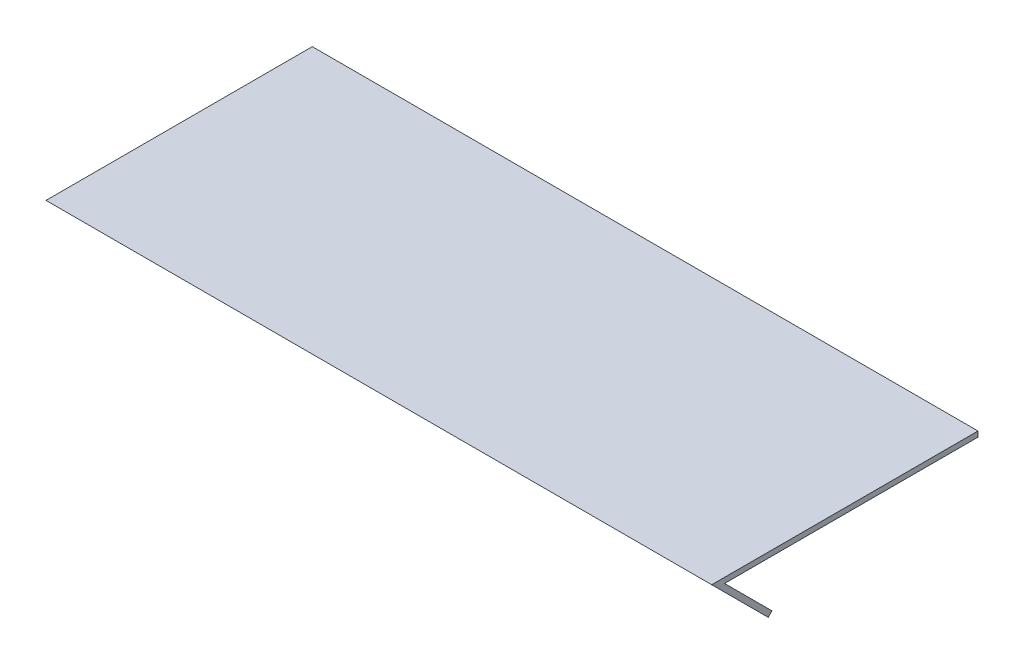
ISO-10303-21;
HEADER;
FILE_DESCRIPTION(('STEP AP214'),'2;1');
FILE_NAME('part.step','',(''),(''),'','','');
FILE_SCHEMA(('AUTOMOTIVE_DESIGN { 1 0 10303 214 1 1 1 1 }'));
ENDSEC;
DATA;
#1=APPLICATION_CONTEXT('core data for automotive mechanical design processes');
#2=APPLICATION_PROTOCOL_DEFINITION('international standard','automotive_design',2000,#1);
#3=PRODUCT_CONTEXT('',#1,'mechanical');
#4=PRODUCT('Part','Part','',(#3));
#5=PRODUCT_RELATED_PRODUCT_CATEGORY('part','',(#4));
#6=PRODUCT_DEFINITION_FORMATION('','',#4);
#7=PRODUCT_DEFINITION_CONTEXT('part definition',#1,'design');
#8=PRODUCT_DEFINITION('design','',#6,#7);
#9=PRODUCT_DEFINITION_SHAPE('','',#8);
#10=(LENGTH_UNIT() NAMED_UNIT(*) SI_UNIT(.MILLI.,.METRE.));
#11=(NAMED_UNIT(*) PLANE_ANGLE_UNIT() SI_UNIT($,.RADIAN.));
#12=(NAMED_UNIT(*) SI_UNIT($,.STERADIAN.) SOLID_ANGLE_UNIT());
#13=UNCERTAINTY_MEASURE_WITH_UNIT(LENGTH_MEASURE(1.E-05),#10,'distance_accuracy_value','');
#14=(GEOMETRIC_REPRESENTATION_CONTEXT(3) GLOBAL_UNCERTAINTY_ASSIGNED_CONTEXT((#13)) GLOBAL_UNIT_ASSIGNED_CONTEXT((#10,
#11,#12)) REPRESENTATION_CONTEXT('',''));
#15=CARTESIAN_POINT('',(0.,0.,0.));
#16=DIRECTION('',(0.,0.,1.));
#17=DIRECTION('',(1.,0.,0.));
#18=AXIS2_PLACEMENT_3D('',#15,#16,#17);
#19=CARTESIAN_POINT('',(125.,0.,-95.1715728752538));
#20=DIRECTION('',(0.,1.,0.));
#21=DIRECTION('',(0.,0.,1.));
#22=AXIS2_PLACEMENT_3D('',#19,#20,#21);
#23=PLANE('',#22);
#24=DIRECTION('',(0.,0.,-1.));
#25=VECTOR('',#24,1.);
#26=CARTESIAN_POINT('',(-125.,0.,-95.1715728752538));
#27=LINE('',#26,#25);
#28=CARTESIAN_POINT('',(-125.,0.,0.));
#29=VERTEX_POINT('',#28);
#30=CARTESIAN_POINT('',(-125.,0.,-95.1715728752538));
#31=VERTEX_POINT('',#30);
#32=EDGE_CURVE('E117',#29,#31,#27,.T.);
#33=ORIENTED_EDGE('',*,*,#32,.T.);
#34=DIRECTION('',(-1.,0.,0.));
#35=VECTOR('',#34,1.);
#36=CARTESIAN_POINT('',(125.,0.,-95.1715728752538));
#37=LINE('',#36,#35);
#38=CARTESIAN_POINT('',(125.,0.,-95.1715728752538));
#39=VERTEX_POINT('',#38);
#40=EDGE_CURVE('E11',#39,#31,#37,.T.);
#41=ORIENTED_EDGE('',*,*,#40,.F.);
#42=DIRECTION('',(0.,0.,-1.));
#43=VECTOR('',#42,1.);
#44=CARTESIAN_POINT('',(125.,0.,-95.1715728752538));
#45=LINE('',#44,#43);
#46=CARTESIAN_POINT('',(125.,0.,0.));
#47=VERTEX_POINT('',#46);
#48=EDGE_CURVE('E127',#47,#39,#45,.T.);
#49=ORIENTED_EDGE('',*,*,#48,.F.);
#50=DIRECTION('',(-1.,0.,0.));
#51=VECTOR('',#50,1.);
#52=CARTESIAN_POINT('',(125.,0.,0.));
#53=LINE('',#52,#51);
#54=EDGE_CURVE('E113',#47,#29,#53,.T.);
#55=ORIENTED_EDGE('',*,*,#54,.T.);
#56=EDGE_LOOP('',(#33,#41,#49,#55));
#57=FACE_BOUND('',#56,.T.);
#58=ADVANCED_FACE('F33',(#57),#23,.F.);
#59=CARTESIAN_POINT('',(125.,2.,-95.1715728752538));
#60=DIRECTION('',(0.,0.,1.));
#61=DIRECTION('',(0.,-1.,0.));
#62=AXIS2_PLACEMENT_3D('',#59,#60,#61);
#63=PLANE('',#62);
#64=DIRECTION('',(0.,1.,0.));
#65=VECTOR('',#64,1.);
#66=CARTESIAN_POINT('',(-125.,2.,-95.1715728752538));
#67=LINE('',#66,#65);
#68=CARTESIAN_POINT('',(-125.,2.,-95.1715728752538));
#69=VERTEX_POINT('',#68);
#70=EDGE_CURVE('E120',#31,#69,#67,.T.);
#71=ORIENTED_EDGE('',*,*,#70,.T.);
#72=DIRECTION('',(-1.,0.,0.));
#73=VECTOR('',#72,1.);
#74=CARTESIAN_POINT('',(125.,2.,-95.1715728752538));
#75=LINE('',#74,#73);
#76=CARTESIAN_POINT('',(125.,2.,-95.1715728752538));
#77=VERTEX_POINT('',#76);
#78=EDGE_CURVE('E41',#77,#69,#75,.T.);
#79=ORIENTED_EDGE('',*,*,#78,.F.);
#80=DIRECTION('',(0.,1.,0.));
#81=VECTOR('',#80,1.);
#82=CARTESIAN_POINT('',(125.,2.,-95.1715728752538));
#83=LINE('',#82,#81);
#84=EDGE_CURVE('E86',#39,#77,#83,.T.);
#85=ORIENTED_EDGE('',*,*,#84,.F.);
#86=ORIENTED_EDGE('',*,*,#40,.T.);
#87=EDGE_LOOP('',(#71,#79,#85,#86));
#88=FACE_BOUND('',#87,.T.);
#89=ADVANCED_FACE('F151',(#88),#63,.F.);
#90=CARTESIAN_POINT('',(125.,2.,4.82842712474623));
#91=DIRECTION('',(0.,-1.,0.));
#92=DIRECTION('',(0.,0.,-1.));
#93=AXIS2_PLACEMENT_3D('',#90,#91,#92);
#94=PLANE('',#93);
#95=DIRECTION('',(0.,0.,1.));
#96=VECTOR('',#95,1.);
#97=CARTESIAN_POINT('',(-125.,2.,4.82842712474623));
#98=LINE('',#97,#96);
#99=CARTESIAN_POINT('',(-125.,2.,4.82842712474623));
#100=VERTEX_POINT('',#99);
#101=EDGE_CURVE('E122',#69,#100,#98,.T.);
#102=ORIENTED_EDGE('',*,*,#101,.T.);
#103=DIRECTION('',(-1.,0.,0.));
#104=VECTOR('',#103,1.);
#105=CARTESIAN_POINT('',(125.,2.,4.82842712474623));
#106=LINE('',#105,#104);
#107=CARTESIAN_POINT('',(125.,2.,4.82842712474623));
#108=VERTEX_POINT('',#107);
#109=EDGE_CURVE('E108',#108,#100,#106,.T.);
#110=ORIENTED_EDGE('',*,*,#109,.F.);
#111=DIRECTION('',(0.,0.,1.));
#112=VECTOR('',#111,1.);
#113=CARTESIAN_POINT('',(125.,2.,4.82842712474623));
#114=LINE('',#113,#112);
#115=EDGE_CURVE('E99',#77,#108,#114,.T.);
#116=ORIENTED_EDGE('',*,*,#115,.F.);
#117=ORIENTED_EDGE('',*,*,#78,.T.);
#118=EDGE_LOOP('',(#102,#110,#116,#117));
#119=FACE_BOUND('',#118,.T.);
#120=ADVANCED_FACE('F133',(#119),#94,.F.);
#121=CARTESIAN_POINT('',(125.,-19.2132034355963,-16.3847763108503));
#122=DIRECTION('',(0.,0.707106781186551,-0.707106781186544));
#123=DIRECTION('',(0.,0.707106781186544,0.707106781186551));
#124=AXIS2_PLACEMENT_3D('',#121,#122,#123);
#125=PLANE('',#124);
#126=DIRECTION('',(0.,-0.707106781186544,-0.707106781186551));
#127=VECTOR('',#126,1.);
#128=CARTESIAN_POINT('',(-125.,-19.2132034355963,-16.3847763108503));
#129=LINE('',#128,#127);
#130=CARTESIAN_POINT('',(-125.,-19.2132034355963,-16.3847763108503));
#131=VERTEX_POINT('',#130);
#132=EDGE_CURVE('E107',#100,#131,#129,.T.);
#133=ORIENTED_EDGE('',*,*,#132,.T.);
#134=DIRECTION('',(-1.,0.,0.));
#135=VECTOR('',#134,1.);
#136=CARTESIAN_POINT('',(125.,-19.2132034355963,-16.3847763108503));
#137=LINE('',#136,#135);
#138=CARTESIAN_POINT('',(125.,-19.2132034355963,-16.3847763108503));
#139=VERTEX_POINT('',#138);
#140=EDGE_CURVE('E104',#139,#131,#137,.T.);
#141=ORIENTED_EDGE('',*,*,#140,.F.);
#142=DIRECTION('',(0.,-0.707106781186544,-0.707106781186551));
#143=VECTOR('',#142,1.);
#144=CARTESIAN_POINT('',(125.,-19.2132034355963,-16.3847763108503));
#145=LINE('',#144,#143);
#146=EDGE_CURVE('E93',#108,#139,#145,.T.);
#147=ORIENTED_EDGE('',*,*,#146,.F.);
#148=ORIENTED_EDGE('',*,*,#109,.T.);
#149=EDGE_LOOP('',(#133,#141,#147,#148));
#150=FACE_BOUND('',#149,.T.);
#151=ADVANCED_FACE('F105',(#150),#125,.F.);
#152=CARTESIAN_POINT('',(125.,-17.7989898732232,-17.7989898732234));
#153=DIRECTION('',(0.,0.707106781186538,0.707106781186557));
#154=DIRECTION('',(0.,-0.707106781186557,0.707106781186538));
#155=AXIS2_PLACEMENT_3D('',#152,#153,#154);
#156=PLANE('',#155);
#157=DIRECTION('',(0.,0.707106781186557,-0.707106781186538));
#158=VECTOR('',#157,1.);
#159=CARTESIAN_POINT('',(-125.,-17.7989898732232,-17.7989898732234));
#160=LINE('',#159,#158);
#161=CARTESIAN_POINT('',(-125.,-17.7989898732232,-17.7989898732234));
#162=VERTEX_POINT('',#161);
#163=EDGE_CURVE('E72',#131,#162,#160,.T.);
#164=ORIENTED_EDGE('',*,*,#163,.T.);
#165=DIRECTION('',(-1.,0.,0.));
#166=VECTOR('',#165,1.);
#167=CARTESIAN_POINT('',(125.,-17.7989898732232,-17.7989898732234));
#168=LINE('',#167,#166);
#169=CARTESIAN_POINT('',(125.,-17.7989898732232,-17.7989898732234));
#170=VERTEX_POINT('',#169);
#171=EDGE_CURVE('E109',#170,#162,#168,.T.);
#172=ORIENTED_EDGE('',*,*,#171,.F.);
#173=DIRECTION('',(0.,0.707106781186557,-0.707106781186538));
#174=VECTOR('',#173,1.);
#175=CARTESIAN_POINT('',(125.,-17.7989898732232,-17.7989898732234));
#176=LINE('',#175,#174);
#177=EDGE_CURVE('E97',#139,#170,#176,.T.);
#178=ORIENTED_EDGE('',*,*,#177,.F.);
#179=ORIENTED_EDGE('',*,*,#140,.T.);
#180=EDGE_LOOP('',(#164,#172,#178,#179));
#181=FACE_BOUND('',#180,.T.);
#182=ADVANCED_FACE('F111',(#181),#156,.F.);
#183=CARTESIAN_POINT('',(125.,0.,0.));
#184=DIRECTION('',(0.,-0.707106781186551,0.707106781186544));
#185=DIRECTION('',(0.,-0.707106781186544,-0.707106781186551));
#186=AXIS2_PLACEMENT_3D('',#183,#184,#185);
#187=PLANE('',#186);
#188=DIRECTION('',(0.,0.707106781186544,0.707106781186551));
#189=VECTOR('',#188,1.);
#190=CARTESIAN_POINT('',(-125.,0.,0.));
#191=LINE('',#190,#189);
#192=EDGE_CURVE('E78',#162,#29,#191,.T.);
#193=ORIENTED_EDGE('',*,*,#192,.T.);
#194=ORIENTED_EDGE('',*,*,#54,.F.);
#195=DIRECTION('',(0.,0.707106781186544,0.707106781186551));
#196=VECTOR('',#195,1.);
#197=CARTESIAN_POINT('',(125.,0.,0.));
#198=LINE('',#197,#196);
#199=EDGE_CURVE('E49',#170,#47,#198,.T.);
#200=ORIENTED_EDGE('',*,*,#199,.F.);
#201=ORIENTED_EDGE('',*,*,#171,.T.);
#202=EDGE_LOOP('',(#193,#194,#200,#201));
#203=FACE_BOUND('',#202,.T.);
#204=ADVANCED_FACE('F140',(#203),#187,.F.);
#205=CARTESIAN_POINT('',(125.,0.,0.));
#206=DIRECTION('',(1.,0.,0.));
#207=DIRECTION('',(0.,0.,-1.));
#208=AXIS2_PLACEMENT_3D('',#205,#206,#207);
#209=PLANE('',#208);
#210=ORIENTED_EDGE('',*,*,#48,.T.);
#211=ORIENTED_EDGE('',*,*,#84,.T.);
#212=ORIENTED_EDGE('',*,*,#115,.T.);
#213=ORIENTED_EDGE('',*,*,#146,.T.);
#214=ORIENTED_EDGE('',*,*,#177,.T.);
#215=ORIENTED_EDGE('',*,*,#199,.T.);
#216=EDGE_LOOP('',(#210,#211,#212,#213,#214,#215));
#217=FACE_BOUND('',#216,.T.);
#218=ADVANCED_FACE('F95',(#217),#209,.T.);
#219=CARTESIAN_POINT('',(-125.,0.,0.));
#220=DIRECTION('',(1.,0.,0.));
#221=DIRECTION('',(0.,0.,-1.));
#222=AXIS2_PLACEMENT_3D('',#219,#220,#221);
#223=PLANE('',#222);
#224=ORIENTED_EDGE('',*,*,#32,.F.);
#225=ORIENTED_EDGE('',*,*,#192,.F.);
#226=ORIENTED_EDGE('',*,*,#163,.F.);
#227=ORIENTED_EDGE('',*,*,#132,.F.);
#228=ORIENTED_EDGE('',*,*,#101,.F.);
#229=ORIENTED_EDGE('',*,*,#70,.F.);
#230=EDGE_LOOP('',(#224,#225,#226,#227,#228,#229));
#231=FACE_BOUND('',#230,.T.);
#232=ADVANCED_FACE('F136',(#231),#223,.F.);
#233=CLOSED_SHELL('',(#58,#89,#120,#151,#182,#204,#218,#232));
#234=MANIFOLD_SOLID_BREP('B2',#233);
#235=ADVANCED_BREP_SHAPE_REPRESENTATION('',(#18,#234),#14);
#236=SHAPE_DEFINITION_REPRESENTATION(#9,#235);
ENDSEC;
END-ISO-10303-21;
